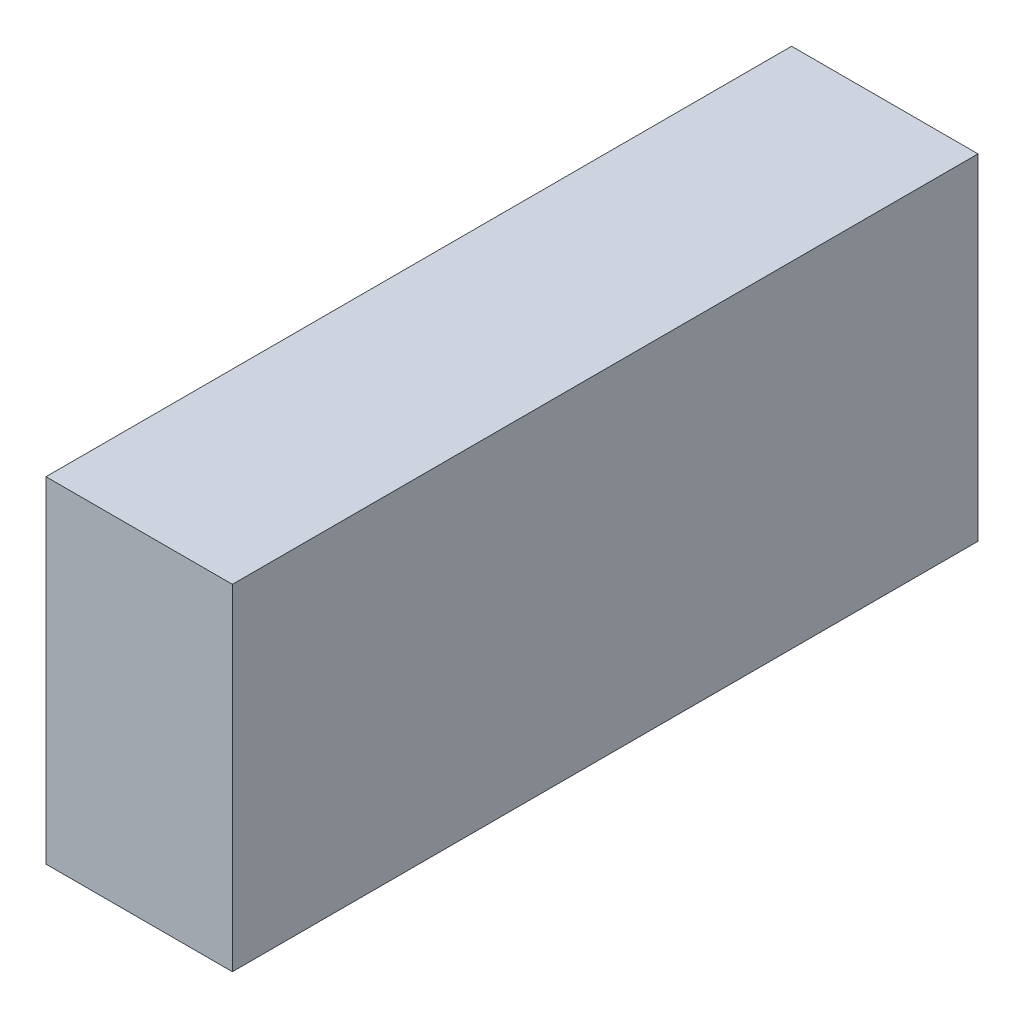
ISO-10303-21;
HEADER;
FILE_DESCRIPTION(('STEP AP214'),'2;1');
FILE_NAME('part.step','',(''),(''),'','','');
FILE_SCHEMA(('AUTOMOTIVE_DESIGN { 1 0 10303 214 1 1 1 1 }'));
ENDSEC;
DATA;
#1=APPLICATION_CONTEXT('core data for automotive mechanical design processes');
#2=APPLICATION_PROTOCOL_DEFINITION('international standard','automotive_design',2000,#1);
#3=PRODUCT_CONTEXT('',#1,'mechanical');
#4=PRODUCT('Part','Part','',(#3));
#5=PRODUCT_RELATED_PRODUCT_CATEGORY('part','',(#4));
#6=PRODUCT_DEFINITION_FORMATION('','',#4);
#7=PRODUCT_DEFINITION_CONTEXT('part definition',#1,'design');
#8=PRODUCT_DEFINITION('design','',#6,#7);
#9=PRODUCT_DEFINITION_SHAPE('','',#8);
#10=(LENGTH_UNIT() NAMED_UNIT(*) SI_UNIT(.MILLI.,.METRE.));
#11=(NAMED_UNIT(*) PLANE_ANGLE_UNIT() SI_UNIT($,.RADIAN.));
#12=(NAMED_UNIT(*) SI_UNIT($,.STERADIAN.) SOLID_ANGLE_UNIT());
#13=UNCERTAINTY_MEASURE_WITH_UNIT(LENGTH_MEASURE(1.E-05),#10,'distance_accuracy_value','');
#14=(GEOMETRIC_REPRESENTATION_CONTEXT(3) GLOBAL_UNCERTAINTY_ASSIGNED_CONTEXT((#13)) GLOBAL_UNIT_ASSIGNED_CONTEXT((#10,
#11,#12)) REPRESENTATION_CONTEXT('',''));
#15=CARTESIAN_POINT('',(0.,0.,0.));
#16=DIRECTION('',(0.,0.,1.));
#17=DIRECTION('',(1.,0.,0.));
#18=AXIS2_PLACEMENT_3D('',#15,#16,#17);
#19=CARTESIAN_POINT('',(0.,0.,200.));
#20=DIRECTION('',(1.,0.,0.));
#21=DIRECTION('',(0.,0.,-1.));
#22=AXIS2_PLACEMENT_3D('',#19,#20,#21);
#23=PLANE('',#22);
#24=DIRECTION('',(0.,-1.,0.));
#25=VECTOR('',#24,1.);
#26=CARTESIAN_POINT('',(0.,0.,0.));
#27=LINE('',#26,#25);
#28=CARTESIAN_POINT('',(0.,90.,0.));
#29=VERTEX_POINT('',#28);
#30=CARTESIAN_POINT('',(0.,0.,0.));
#31=VERTEX_POINT('',#30);
#32=EDGE_CURVE('E100',#29,#31,#27,.T.);
#33=ORIENTED_EDGE('',*,*,#32,.T.);
#34=DIRECTION('',(0.,0.,-1.));
#35=VECTOR('',#34,1.);
#36=CARTESIAN_POINT('',(0.,0.,200.));
#37=LINE('',#36,#35);
#38=CARTESIAN_POINT('',(0.,0.,200.));
#39=VERTEX_POINT('',#38);
#40=EDGE_CURVE('E11',#39,#31,#37,.T.);
#41=ORIENTED_EDGE('',*,*,#40,.F.);
#42=DIRECTION('',(0.,-1.,0.));
#43=VECTOR('',#42,1.);
#44=CARTESIAN_POINT('',(0.,0.,200.));
#45=LINE('',#44,#43);
#46=CARTESIAN_POINT('',(0.,90.,200.));
#47=VERTEX_POINT('',#46);
#48=EDGE_CURVE('E88',#47,#39,#45,.T.);
#49=ORIENTED_EDGE('',*,*,#48,.F.);
#50=DIRECTION('',(0.,0.,-1.));
#51=VECTOR('',#50,1.);
#52=CARTESIAN_POINT('',(0.,90.,200.));
#53=LINE('',#52,#51);
#54=EDGE_CURVE('E96',#47,#29,#53,.T.);
#55=ORIENTED_EDGE('',*,*,#54,.T.);
#56=EDGE_LOOP('',(#33,#41,#49,#55));
#57=FACE_BOUND('',#56,.T.);
#58=ADVANCED_FACE('F37',(#57),#23,.F.);
#59=CARTESIAN_POINT('',(0.,0.,200.));
#60=DIRECTION('',(0.,1.,0.));
#61=DIRECTION('',(0.,0.,1.));
#62=AXIS2_PLACEMENT_3D('',#59,#60,#61);
#63=PLANE('',#62);
#64=DIRECTION('',(1.,0.,0.));
#65=VECTOR('',#64,1.);
#66=CARTESIAN_POINT('',(0.,0.,0.));
#67=LINE('',#66,#65);
#68=CARTESIAN_POINT('',(50.,0.,0.));
#69=VERTEX_POINT('',#68);
#70=EDGE_CURVE('E92',#31,#69,#67,.T.);
#71=ORIENTED_EDGE('',*,*,#70,.T.);
#72=DIRECTION('',(0.,0.,-1.));
#73=VECTOR('',#72,1.);
#74=CARTESIAN_POINT('',(50.,0.,200.));
#75=LINE('',#74,#73);
#76=CARTESIAN_POINT('',(50.,0.,200.));
#77=VERTEX_POINT('',#76);
#78=EDGE_CURVE('E45',#77,#69,#75,.T.);
#79=ORIENTED_EDGE('',*,*,#78,.F.);
#80=DIRECTION('',(1.,0.,0.));
#81=VECTOR('',#80,1.);
#82=CARTESIAN_POINT('',(0.,0.,200.));
#83=LINE('',#82,#81);
#84=EDGE_CURVE('E83',#39,#77,#83,.T.);
#85=ORIENTED_EDGE('',*,*,#84,.F.);
#86=ORIENTED_EDGE('',*,*,#40,.T.);
#87=EDGE_LOOP('',(#71,#79,#85,#86));
#88=FACE_BOUND('',#87,.T.);
#89=ADVANCED_FACE('F91',(#88),#63,.F.);
#90=CARTESIAN_POINT('',(50.,0.,200.));
#91=DIRECTION('',(-1.,0.,0.));
#92=DIRECTION('',(0.,0.,1.));
#93=AXIS2_PLACEMENT_3D('',#90,#91,#92);
#94=PLANE('',#93);
#95=DIRECTION('',(0.,1.,0.));
#96=VECTOR('',#95,1.);
#97=CARTESIAN_POINT('',(50.,0.,0.));
#98=LINE('',#97,#96);
#99=CARTESIAN_POINT('',(50.,90.,0.));
#100=VERTEX_POINT('',#99);
#101=EDGE_CURVE('E70',#69,#100,#98,.T.);
#102=ORIENTED_EDGE('',*,*,#101,.T.);
#103=DIRECTION('',(0.,0.,-1.));
#104=VECTOR('',#103,1.);
#105=CARTESIAN_POINT('',(50.,90.,200.));
#106=LINE('',#105,#104);
#107=CARTESIAN_POINT('',(50.,90.,200.));
#108=VERTEX_POINT('',#107);
#109=EDGE_CURVE('E93',#108,#100,#106,.T.);
#110=ORIENTED_EDGE('',*,*,#109,.F.);
#111=DIRECTION('',(0.,1.,0.));
#112=VECTOR('',#111,1.);
#113=CARTESIAN_POINT('',(50.,0.,200.));
#114=LINE('',#113,#112);
#115=EDGE_CURVE('E86',#77,#108,#114,.T.);
#116=ORIENTED_EDGE('',*,*,#115,.F.);
#117=ORIENTED_EDGE('',*,*,#78,.T.);
#118=EDGE_LOOP('',(#102,#110,#116,#117));
#119=FACE_BOUND('',#118,.T.);
#120=ADVANCED_FACE('F94',(#119),#94,.F.);
#121=CARTESIAN_POINT('',(0.,90.,200.));
#122=DIRECTION('',(0.,-1.,0.));
#123=DIRECTION('',(0.,0.,-1.));
#124=AXIS2_PLACEMENT_3D('',#121,#122,#123);
#125=PLANE('',#124);
#126=DIRECTION('',(-1.,0.,0.));
#127=VECTOR('',#126,1.);
#128=CARTESIAN_POINT('',(0.,90.,0.));
#129=LINE('',#128,#127);
#130=EDGE_CURVE('E76',#100,#29,#129,.T.);
#131=ORIENTED_EDGE('',*,*,#130,.T.);
#132=ORIENTED_EDGE('',*,*,#54,.F.);
#133=DIRECTION('',(-1.,0.,0.));
#134=VECTOR('',#133,1.);
#135=CARTESIAN_POINT('',(0.,90.,200.));
#136=LINE('',#135,#134);
#137=EDGE_CURVE('E53',#108,#47,#136,.T.);
#138=ORIENTED_EDGE('',*,*,#137,.F.);
#139=ORIENTED_EDGE('',*,*,#109,.T.);
#140=EDGE_LOOP('',(#131,#132,#138,#139));
#141=FACE_BOUND('',#140,.T.);
#142=ADVANCED_FACE('F107',(#141),#125,.F.);
#143=CARTESIAN_POINT('',(0.,0.,200.));
#144=DIRECTION('',(0.,0.,-1.));
#145=DIRECTION('',(-1.,0.,0.));
#146=AXIS2_PLACEMENT_3D('',#143,#144,#145);
#147=PLANE('',#146);
#148=ORIENTED_EDGE('',*,*,#48,.T.);
#149=ORIENTED_EDGE('',*,*,#84,.T.);
#150=ORIENTED_EDGE('',*,*,#115,.T.);
#151=ORIENTED_EDGE('',*,*,#137,.T.);
#152=EDGE_LOOP('',(#148,#149,#150,#151));
#153=FACE_BOUND('',#152,.T.);
#154=ADVANCED_FACE('F84',(#153),#147,.F.);
#155=CARTESIAN_POINT('',(0.,0.,0.));
#156=DIRECTION('',(0.,0.,-1.));
#157=DIRECTION('',(-1.,0.,0.));
#158=AXIS2_PLACEMENT_3D('',#155,#156,#157);
#159=PLANE('',#158);
#160=ORIENTED_EDGE('',*,*,#32,.F.);
#161=ORIENTED_EDGE('',*,*,#130,.F.);
#162=ORIENTED_EDGE('',*,*,#101,.F.);
#163=ORIENTED_EDGE('',*,*,#70,.F.);
#164=EDGE_LOOP('',(#160,#161,#162,#163));
#165=FACE_BOUND('',#164,.T.);
#166=ADVANCED_FACE('F110',(#165),#159,.T.);
#167=CLOSED_SHELL('',(#58,#89,#120,#142,#154,#166));
#168=MANIFOLD_SOLID_BREP('B2',#167);
#169=ADVANCED_BREP_SHAPE_REPRESENTATION('',(#18,#168),#14);
#170=SHAPE_DEFINITION_REPRESENTATION(#9,#169);
ENDSEC;
END-ISO-10303-21;
